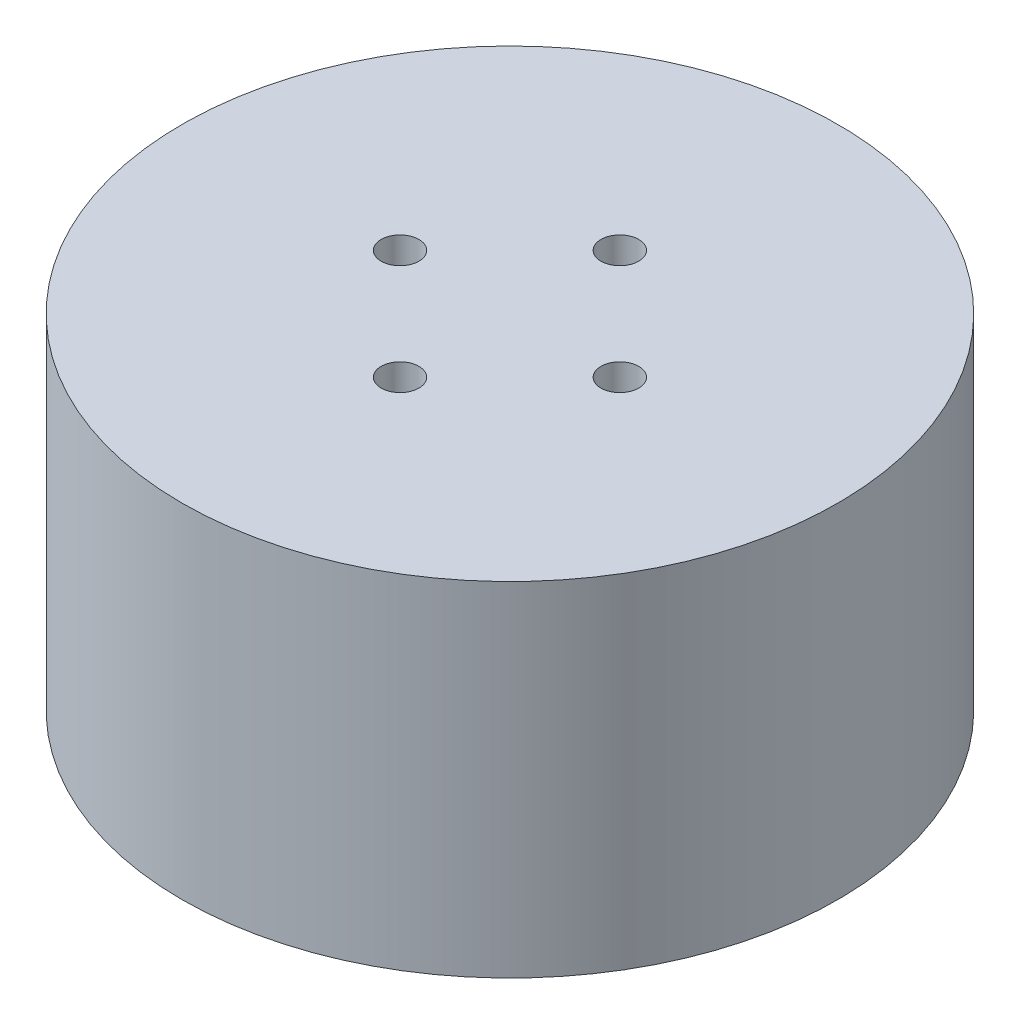
ISO-10303-21;
HEADER;
FILE_DESCRIPTION(('STEP AP214'),'2;1');
FILE_NAME('part.step','',(''),(''),'','','');
FILE_SCHEMA(('AUTOMOTIVE_DESIGN { 1 0 10303 214 1 1 1 1 }'));
ENDSEC;
DATA;
#1=APPLICATION_CONTEXT('core data for automotive mechanical design processes');
#2=APPLICATION_PROTOCOL_DEFINITION('international standard','automotive_design',2000,#1);
#3=PRODUCT_CONTEXT('',#1,'mechanical');
#4=PRODUCT('Part','Part','',(#3));
#5=PRODUCT_RELATED_PRODUCT_CATEGORY('part','',(#4));
#6=PRODUCT_DEFINITION_FORMATION('','',#4);
#7=PRODUCT_DEFINITION_CONTEXT('part definition',#1,'design');
#8=PRODUCT_DEFINITION('design','',#6,#7);
#9=PRODUCT_DEFINITION_SHAPE('','',#8);
#10=(LENGTH_UNIT() NAMED_UNIT(*) SI_UNIT(.MILLI.,.METRE.));
#11=(NAMED_UNIT(*) PLANE_ANGLE_UNIT() SI_UNIT($,.RADIAN.));
#12=(NAMED_UNIT(*) SI_UNIT($,.STERADIAN.) SOLID_ANGLE_UNIT());
#13=UNCERTAINTY_MEASURE_WITH_UNIT(LENGTH_MEASURE(1.E-05),#10,'distance_accuracy_value','');
#14=(GEOMETRIC_REPRESENTATION_CONTEXT(3) GLOBAL_UNCERTAINTY_ASSIGNED_CONTEXT((#13)) GLOBAL_UNIT_ASSIGNED_CONTEXT((#10,
#11,#12)) REPRESENTATION_CONTEXT('',''));
#15=CARTESIAN_POINT('',(0.,0.,0.));
#16=DIRECTION('',(0.,0.,1.));
#17=DIRECTION('',(1.,0.,0.));
#18=AXIS2_PLACEMENT_3D('',#15,#16,#17);
#19=CARTESIAN_POINT('',(0.,50.,0.));
#20=DIRECTION('',(0.,-1.,0.));
#21=DIRECTION('',(0.,0.,-1.));
#22=AXIS2_PLACEMENT_3D('',#19,#20,#21);
#23=CYLINDRICAL_SURFACE('',#22,47.75);
#24=CARTESIAN_POINT('',(0.,50.,0.));
#25=DIRECTION('',(0.,1.,0.));
#26=DIRECTION('',(0.,0.,1.));
#27=AXIS2_PLACEMENT_3D('',#24,#25,#26);
#28=CIRCLE('',#27,47.75);
#29=CARTESIAN_POINT('',(0.,50.,47.75));
#30=VERTEX_POINT('',#29);
#31=EDGE_CURVE('E10',#30,#30,#28,.T.);
#32=ORIENTED_EDGE('',*,*,#31,.F.);
#33=EDGE_LOOP('',(#32));
#34=FACE_BOUND('',#33,.T.);
#35=CARTESIAN_POINT('',(0.,0.,0.));
#36=DIRECTION('',(0.,1.,0.));
#37=DIRECTION('',(0.,0.,1.));
#38=AXIS2_PLACEMENT_3D('',#35,#36,#37);
#39=CIRCLE('',#38,47.75);
#40=CARTESIAN_POINT('',(0.,0.,47.75));
#41=VERTEX_POINT('',#40);
#42=EDGE_CURVE('E42',#41,#41,#39,.T.);
#43=ORIENTED_EDGE('',*,*,#42,.T.);
#44=EDGE_LOOP('',(#43));
#45=FACE_BOUND('',#44,.T.);
#46=ADVANCED_FACE('F35',(#34,#45),#23,.T.);
#47=CARTESIAN_POINT('',(0.,50.,0.));
#48=DIRECTION('',(0.,1.,0.));
#49=DIRECTION('',(0.,0.,1.));
#50=AXIS2_PLACEMENT_3D('',#47,#48,#49);
#51=PLANE('',#50);
#52=CARTESIAN_POINT('',(0.,50.,-16.));
#53=DIRECTION('',(0.,1.,0.));
#54=DIRECTION('',(0.,0.,1.));
#55=AXIS2_PLACEMENT_3D('',#52,#53,#54);
#56=CIRCLE('',#55,2.75);
#57=CARTESIAN_POINT('',(0.,50.,-13.25));
#58=VERTEX_POINT('',#57);
#59=EDGE_CURVE('E61',#58,#58,#56,.T.);
#60=ORIENTED_EDGE('',*,*,#59,.F.);
#61=EDGE_LOOP('',(#60));
#62=FACE_BOUND('',#61,.T.);
#63=CARTESIAN_POINT('',(16.,50.,0.));
#64=DIRECTION('',(0.,1.,0.));
#65=DIRECTION('',(0.,0.,1.));
#66=AXIS2_PLACEMENT_3D('',#63,#64,#65);
#67=CIRCLE('',#66,2.75);
#68=CARTESIAN_POINT('',(16.,50.,2.75));
#69=VERTEX_POINT('',#68);
#70=EDGE_CURVE('E152',#69,#69,#67,.T.);
#71=ORIENTED_EDGE('',*,*,#70,.F.);
#72=EDGE_LOOP('',(#71));
#73=FACE_BOUND('',#72,.T.);
#74=CARTESIAN_POINT('',(0.,50.,16.));
#75=DIRECTION('',(0.,1.,0.));
#76=DIRECTION('',(0.,0.,1.));
#77=AXIS2_PLACEMENT_3D('',#74,#75,#76);
#78=CIRCLE('',#77,2.75);
#79=CARTESIAN_POINT('',(0.,50.,18.75));
#80=VERTEX_POINT('',#79);
#81=EDGE_CURVE('E74',#80,#80,#78,.T.);
#82=ORIENTED_EDGE('',*,*,#81,.F.);
#83=EDGE_LOOP('',(#82));
#84=FACE_BOUND('',#83,.T.);
#85=CARTESIAN_POINT('',(-16.,50.,0.));
#86=DIRECTION('',(0.,1.,0.));
#87=DIRECTION('',(0.,0.,1.));
#88=AXIS2_PLACEMENT_3D('',#85,#86,#87);
#89=CIRCLE('',#88,2.75);
#90=CARTESIAN_POINT('',(-16.,50.,2.75));
#91=VERTEX_POINT('',#90);
#92=EDGE_CURVE('E57',#91,#91,#89,.T.);
#93=ORIENTED_EDGE('',*,*,#92,.F.);
#94=EDGE_LOOP('',(#93));
#95=FACE_BOUND('',#94,.T.);
#96=ORIENTED_EDGE('',*,*,#31,.T.);
#97=EDGE_LOOP('',(#96));
#98=FACE_BOUND('',#97,.T.);
#99=ADVANCED_FACE('F97',(#62,#73,#84,#95,#98),#51,.T.);
#100=CARTESIAN_POINT('',(0.,0.,0.));
#101=DIRECTION('',(0.,1.,0.));
#102=DIRECTION('',(0.,0.,1.));
#103=AXIS2_PLACEMENT_3D('',#100,#101,#102);
#104=PLANE('',#103);
#105=CARTESIAN_POINT('',(0.,0.,0.));
#106=DIRECTION('',(0.,-1.,0.));
#107=DIRECTION('',(0.,0.,-1.));
#108=AXIS2_PLACEMENT_3D('',#105,#106,#107);
#109=CIRCLE('',#108,26.);
#110=CARTESIAN_POINT('',(0.,0.,-26.));
#111=VERTEX_POINT('',#110);
#112=EDGE_CURVE('E50',#111,#111,#109,.T.);
#113=ORIENTED_EDGE('',*,*,#112,.F.);
#114=EDGE_LOOP('',(#113));
#115=FACE_BOUND('',#114,.T.);
#116=ORIENTED_EDGE('',*,*,#42,.F.);
#117=EDGE_LOOP('',(#116));
#118=FACE_BOUND('',#117,.T.);
#119=ADVANCED_FACE('F94',(#115,#118),#104,.F.);
#120=CARTESIAN_POINT('',(0.,20.,0.));
#121=DIRECTION('',(0.,-1.,0.));
#122=DIRECTION('',(0.,0.,-1.));
#123=AXIS2_PLACEMENT_3D('',#120,#121,#122);
#124=CYLINDRICAL_SURFACE('',#123,26.);
#125=CARTESIAN_POINT('',(0.,20.,0.));
#126=DIRECTION('',(0.,-1.,0.));
#127=DIRECTION('',(0.,0.,-1.));
#128=AXIS2_PLACEMENT_3D('',#125,#126,#127);
#129=CIRCLE('',#128,26.);
#130=CARTESIAN_POINT('',(0.,20.,-26.));
#131=VERTEX_POINT('',#130);
#132=EDGE_CURVE('E47',#131,#131,#129,.T.);
#133=ORIENTED_EDGE('',*,*,#132,.F.);
#134=EDGE_LOOP('',(#133));
#135=FACE_BOUND('',#134,.T.);
#136=ORIENTED_EDGE('',*,*,#112,.T.);
#137=EDGE_LOOP('',(#136));
#138=FACE_BOUND('',#137,.T.);
#139=ADVANCED_FACE('F92',(#135,#138),#124,.F.);
#140=CARTESIAN_POINT('',(0.,20.,0.));
#141=DIRECTION('',(0.,-1.,0.));
#142=DIRECTION('',(0.,0.,-1.));
#143=AXIS2_PLACEMENT_3D('',#140,#141,#142);
#144=PLANE('',#143);
#145=CARTESIAN_POINT('',(0.,20.,-16.));
#146=DIRECTION('',(0.,-1.,0.));
#147=DIRECTION('',(0.,0.,-1.));
#148=AXIS2_PLACEMENT_3D('',#145,#146,#147);
#149=CIRCLE('',#148,2.75);
#150=CARTESIAN_POINT('',(0.,20.,-18.75));
#151=VERTEX_POINT('',#150);
#152=EDGE_CURVE('E38',#151,#151,#149,.T.);
#153=ORIENTED_EDGE('',*,*,#152,.F.);
#154=EDGE_LOOP('',(#153));
#155=FACE_BOUND('',#154,.T.);
#156=CARTESIAN_POINT('',(16.,20.,0.));
#157=DIRECTION('',(0.,-1.,0.));
#158=DIRECTION('',(0.,0.,-1.));
#159=AXIS2_PLACEMENT_3D('',#156,#157,#158);
#160=CIRCLE('',#159,2.75);
#161=CARTESIAN_POINT('',(16.,20.,-2.75));
#162=VERTEX_POINT('',#161);
#163=EDGE_CURVE('E60',#162,#162,#160,.T.);
#164=ORIENTED_EDGE('',*,*,#163,.F.);
#165=EDGE_LOOP('',(#164));
#166=FACE_BOUND('',#165,.T.);
#167=CARTESIAN_POINT('',(0.,20.,16.));
#168=DIRECTION('',(0.,-1.,0.));
#169=DIRECTION('',(0.,0.,-1.));
#170=AXIS2_PLACEMENT_3D('',#167,#168,#169);
#171=CIRCLE('',#170,2.75);
#172=CARTESIAN_POINT('',(0.,20.,13.25));
#173=VERTEX_POINT('',#172);
#174=EDGE_CURVE('E58',#173,#173,#171,.T.);
#175=ORIENTED_EDGE('',*,*,#174,.F.);
#176=EDGE_LOOP('',(#175));
#177=FACE_BOUND('',#176,.T.);
#178=CARTESIAN_POINT('',(-16.,20.,0.));
#179=DIRECTION('',(0.,-1.,0.));
#180=DIRECTION('',(0.,0.,-1.));
#181=AXIS2_PLACEMENT_3D('',#178,#179,#180);
#182=CIRCLE('',#181,2.75);
#183=CARTESIAN_POINT('',(-16.,20.,-2.75));
#184=VERTEX_POINT('',#183);
#185=EDGE_CURVE('E53',#184,#184,#182,.T.);
#186=ORIENTED_EDGE('',*,*,#185,.F.);
#187=EDGE_LOOP('',(#186));
#188=FACE_BOUND('',#187,.T.);
#189=CARTESIAN_POINT('',(0.,20.,0.));
#190=DIRECTION('',(0.,-1.,0.));
#191=DIRECTION('',(0.,0.,-1.));
#192=AXIS2_PLACEMENT_3D('',#189,#190,#191);
#193=CIRCLE('',#192,11.);
#194=CARTESIAN_POINT('',(0.,20.,-11.));
#195=VERTEX_POINT('',#194);
#196=EDGE_CURVE('E79',#195,#195,#193,.T.);
#197=ORIENTED_EDGE('',*,*,#196,.F.);
#198=EDGE_LOOP('',(#197));
#199=FACE_BOUND('',#198,.T.);
#200=ORIENTED_EDGE('',*,*,#132,.T.);
#201=EDGE_LOOP('',(#200));
#202=FACE_BOUND('',#201,.T.);
#203=ADVANCED_FACE('F114',(#155,#166,#177,#188,#199,#202),#144,.T.);
#204=CARTESIAN_POINT('',(0.,27.5,0.));
#205=DIRECTION('',(0.,-1.,0.));
#206=DIRECTION('',(0.,0.,-1.));
#207=AXIS2_PLACEMENT_3D('',#204,#205,#206);
#208=CYLINDRICAL_SURFACE('',#207,11.);
#209=CARTESIAN_POINT('',(0.,27.5,0.));
#210=DIRECTION('',(0.,-1.,0.));
#211=DIRECTION('',(0.,0.,-1.));
#212=AXIS2_PLACEMENT_3D('',#209,#210,#211);
#213=CIRCLE('',#212,11.);
#214=CARTESIAN_POINT('',(0.,27.5,-11.));
#215=VERTEX_POINT('',#214);
#216=EDGE_CURVE('E82',#215,#215,#213,.T.);
#217=ORIENTED_EDGE('',*,*,#216,.F.);
#218=EDGE_LOOP('',(#217));
#219=FACE_BOUND('',#218,.T.);
#220=ORIENTED_EDGE('',*,*,#196,.T.);
#221=EDGE_LOOP('',(#220));
#222=FACE_BOUND('',#221,.T.);
#223=ADVANCED_FACE('F118',(#219,#222),#208,.F.);
#224=CARTESIAN_POINT('',(0.,27.5,0.));
#225=DIRECTION('',(0.,-1.,0.));
#226=DIRECTION('',(0.,0.,-1.));
#227=AXIS2_PLACEMENT_3D('',#224,#225,#226);
#228=PLANE('',#227);
#229=CARTESIAN_POINT('',(0.,27.5,0.));
#230=DIRECTION('',(0.,-1.,0.));
#231=DIRECTION('',(0.,0.,-1.));
#232=AXIS2_PLACEMENT_3D('',#229,#230,#231);
#233=CIRCLE('',#232,5.);
#234=CARTESIAN_POINT('',(0.,27.5,-5.));
#235=VERTEX_POINT('',#234);
#236=EDGE_CURVE('E56',#235,#235,#233,.T.);
#237=ORIENTED_EDGE('',*,*,#236,.F.);
#238=EDGE_LOOP('',(#237));
#239=FACE_BOUND('',#238,.T.);
#240=ORIENTED_EDGE('',*,*,#216,.T.);
#241=EDGE_LOOP('',(#240));
#242=FACE_BOUND('',#241,.T.);
#243=ADVANCED_FACE('F122',(#239,#242),#228,.T.);
#244=CARTESIAN_POINT('',(0.,41.,0.));
#245=DIRECTION('',(0.,-1.,0.));
#246=DIRECTION('',(0.,0.,-1.));
#247=AXIS2_PLACEMENT_3D('',#244,#245,#246);
#248=CYLINDRICAL_SURFACE('',#247,5.);
#249=CARTESIAN_POINT('',(0.,41.,0.));
#250=DIRECTION('',(0.,-1.,0.));
#251=DIRECTION('',(0.,0.,-1.));
#252=AXIS2_PLACEMENT_3D('',#249,#250,#251);
#253=CIRCLE('',#252,5.);
#254=CARTESIAN_POINT('',(0.,41.,-5.));
#255=VERTEX_POINT('',#254);
#256=EDGE_CURVE('E76',#255,#255,#253,.T.);
#257=ORIENTED_EDGE('',*,*,#256,.F.);
#258=EDGE_LOOP('',(#257));
#259=FACE_BOUND('',#258,.T.);
#260=ORIENTED_EDGE('',*,*,#236,.T.);
#261=EDGE_LOOP('',(#260));
#262=FACE_BOUND('',#261,.T.);
#263=ADVANCED_FACE('F126',(#259,#262),#248,.F.);
#264=CARTESIAN_POINT('',(0.,41.,0.));
#265=DIRECTION('',(0.,-1.,0.));
#266=DIRECTION('',(0.,0.,-1.));
#267=AXIS2_PLACEMENT_3D('',#264,#265,#266);
#268=PLANE('',#267);
#269=ORIENTED_EDGE('',*,*,#256,.T.);
#270=EDGE_LOOP('',(#269));
#271=FACE_BOUND('',#270,.T.);
#272=ADVANCED_FACE('F130',(#271),#268,.T.);
#273=CARTESIAN_POINT('',(-16.,0.,0.));
#274=DIRECTION('',(0.,1.,0.));
#275=DIRECTION('',(0.,0.,1.));
#276=AXIS2_PLACEMENT_3D('',#273,#274,#275);
#277=CYLINDRICAL_SURFACE('',#276,2.75);
#278=ORIENTED_EDGE('',*,*,#185,.T.);
#279=EDGE_LOOP('',(#278));
#280=FACE_BOUND('',#279,.T.);
#281=ORIENTED_EDGE('',*,*,#92,.T.);
#282=EDGE_LOOP('',(#281));
#283=FACE_BOUND('',#282,.T.);
#284=ADVANCED_FACE('F134',(#280,#283),#277,.F.);
#285=CARTESIAN_POINT('',(0.,0.,16.));
#286=DIRECTION('',(0.,1.,0.));
#287=DIRECTION('',(0.,0.,1.));
#288=AXIS2_PLACEMENT_3D('',#285,#286,#287);
#289=CYLINDRICAL_SURFACE('',#288,2.75);
#290=ORIENTED_EDGE('',*,*,#174,.T.);
#291=EDGE_LOOP('',(#290));
#292=FACE_BOUND('',#291,.T.);
#293=ORIENTED_EDGE('',*,*,#81,.T.);
#294=EDGE_LOOP('',(#293));
#295=FACE_BOUND('',#294,.T.);
#296=ADVANCED_FACE('F138',(#292,#295),#289,.F.);
#297=CARTESIAN_POINT('',(16.,0.,0.));
#298=DIRECTION('',(0.,1.,0.));
#299=DIRECTION('',(0.,0.,1.));
#300=AXIS2_PLACEMENT_3D('',#297,#298,#299);
#301=CYLINDRICAL_SURFACE('',#300,2.75);
#302=ORIENTED_EDGE('',*,*,#163,.T.);
#303=EDGE_LOOP('',(#302));
#304=FACE_BOUND('',#303,.T.);
#305=ORIENTED_EDGE('',*,*,#70,.T.);
#306=EDGE_LOOP('',(#305));
#307=FACE_BOUND('',#306,.T.);
#308=ADVANCED_FACE('F142',(#304,#307),#301,.F.);
#309=CARTESIAN_POINT('',(0.,0.,-16.));
#310=DIRECTION('',(0.,1.,0.));
#311=DIRECTION('',(0.,0.,1.));
#312=AXIS2_PLACEMENT_3D('',#309,#310,#311);
#313=CYLINDRICAL_SURFACE('',#312,2.75);
#314=ORIENTED_EDGE('',*,*,#152,.T.);
#315=EDGE_LOOP('',(#314));
#316=FACE_BOUND('',#315,.T.);
#317=ORIENTED_EDGE('',*,*,#59,.T.);
#318=EDGE_LOOP('',(#317));
#319=FACE_BOUND('',#318,.T.);
#320=ADVANCED_FACE('F146',(#316,#319),#313,.F.);
#321=CLOSED_SHELL('',(#46,#99,#119,#139,#203,#223,#243,#263,#272,#284,#296,#308,#320));
#322=MANIFOLD_SOLID_BREP('B2',#321);
#323=ADVANCED_BREP_SHAPE_REPRESENTATION('',(#18,#322),#14);
#324=SHAPE_DEFINITION_REPRESENTATION(#9,#323);
ENDSEC;
END-ISO-10303-21;
